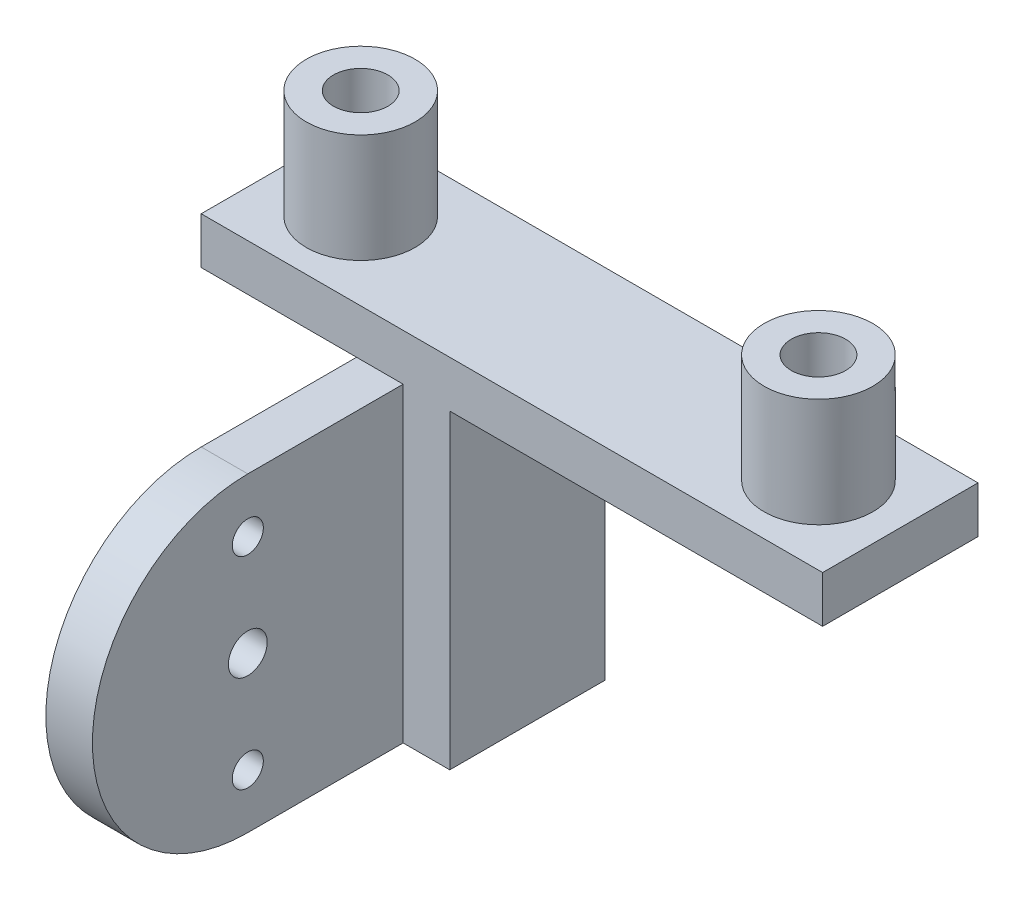
ISO-10303-21;
HEADER;
FILE_DESCRIPTION(('STEP AP214'),'2;1');
FILE_NAME('part.step','',(''),(''),'','','');
FILE_SCHEMA(('AUTOMOTIVE_DESIGN { 1 0 10303 214 1 1 1 1 }'));
ENDSEC;
DATA;
#1=APPLICATION_CONTEXT('core data for automotive mechanical design processes');
#2=APPLICATION_PROTOCOL_DEFINITION('international standard','automotive_design',2000,#1);
#3=PRODUCT_CONTEXT('',#1,'mechanical');
#4=PRODUCT('Part','Part','',(#3));
#5=PRODUCT_RELATED_PRODUCT_CATEGORY('part','',(#4));
#6=PRODUCT_DEFINITION_FORMATION('','',#4);
#7=PRODUCT_DEFINITION_CONTEXT('part definition',#1,'design');
#8=PRODUCT_DEFINITION('design','',#6,#7);
#9=PRODUCT_DEFINITION_SHAPE('','',#8);
#10=(LENGTH_UNIT() NAMED_UNIT(*) SI_UNIT(.MILLI.,.METRE.));
#11=(NAMED_UNIT(*) PLANE_ANGLE_UNIT() SI_UNIT($,.RADIAN.));
#12=(NAMED_UNIT(*) SI_UNIT($,.STERADIAN.) SOLID_ANGLE_UNIT());
#13=UNCERTAINTY_MEASURE_WITH_UNIT(LENGTH_MEASURE(1.E-05),#10,'distance_accuracy_value','');
#14=(GEOMETRIC_REPRESENTATION_CONTEXT(3) GLOBAL_UNCERTAINTY_ASSIGNED_CONTEXT((#13)) GLOBAL_UNIT_ASSIGNED_CONTEXT((#10,
#11,#12)) REPRESENTATION_CONTEXT('',''));
#15=CARTESIAN_POINT('',(0.,0.,0.));
#16=DIRECTION('',(0.,0.,1.));
#17=DIRECTION('',(1.,0.,0.));
#18=AXIS2_PLACEMENT_3D('',#15,#16,#17);
#19=CARTESIAN_POINT('',(0.,3.,0.));
#20=DIRECTION('',(0.,-1.,0.));
#21=DIRECTION('',(0.,0.,-1.));
#22=AXIS2_PLACEMENT_3D('',#19,#20,#21);
#23=PLANE('',#22);
#24=DIRECTION('',(0.,0.,1.));
#25=VECTOR('',#24,1.);
#26=CARTESIAN_POINT('',(-20.,3.,-5.));
#27=LINE('',#26,#25);
#28=CARTESIAN_POINT('',(-20.,3.,-5.));
#29=VERTEX_POINT('',#28);
#30=CARTESIAN_POINT('',(-20.,3.,5.));
#31=VERTEX_POINT('',#30);
#32=EDGE_CURVE('E190',#29,#31,#27,.T.);
#33=ORIENTED_EDGE('',*,*,#32,.T.);
#34=DIRECTION('',(1.,0.,0.));
#35=VECTOR('',#34,1.);
#36=CARTESIAN_POINT('',(20.,3.,5.));
#37=LINE('',#36,#35);
#38=CARTESIAN_POINT('',(20.,3.,5.));
#39=VERTEX_POINT('',#38);
#40=EDGE_CURVE('E193',#31,#39,#37,.T.);
#41=ORIENTED_EDGE('',*,*,#40,.T.);
#42=DIRECTION('',(0.,0.,-1.));
#43=VECTOR('',#42,1.);
#44=CARTESIAN_POINT('',(20.,3.,-5.));
#45=LINE('',#44,#43);
#46=CARTESIAN_POINT('',(20.,3.,-5.));
#47=VERTEX_POINT('',#46);
#48=EDGE_CURVE('E196',#39,#47,#45,.T.);
#49=ORIENTED_EDGE('',*,*,#48,.T.);
#50=DIRECTION('',(-1.,0.,0.));
#51=VECTOR('',#50,1.);
#52=CARTESIAN_POINT('',(20.,3.,-5.));
#53=LINE('',#52,#51);
#54=EDGE_CURVE('E198',#47,#29,#53,.T.);
#55=ORIENTED_EDGE('',*,*,#54,.T.);
#56=EDGE_LOOP('',(#33,#41,#49,#55));
#57=FACE_BOUND('',#56,.T.);
#58=CARTESIAN_POINT('',(-14.732,3.,0.));
#59=DIRECTION('',(0.,1.,0.));
#60=DIRECTION('',(0.,0.,1.));
#61=AXIS2_PLACEMENT_3D('',#58,#59,#60);
#62=CIRCLE('',#61,3.5);
#63=CARTESIAN_POINT('',(-14.732,3.,3.5));
#64=VERTEX_POINT('',#63);
#65=EDGE_CURVE('E43',#64,#64,#62,.T.);
#66=ORIENTED_EDGE('',*,*,#65,.F.);
#67=EDGE_LOOP('',(#66));
#68=FACE_BOUND('',#67,.T.);
#69=CARTESIAN_POINT('',(14.732,3.,0.));
#70=DIRECTION('',(0.,-1.,0.));
#71=DIRECTION('',(0.,0.,-1.));
#72=AXIS2_PLACEMENT_3D('',#69,#70,#71);
#73=CIRCLE('',#72,3.5);
#74=CARTESIAN_POINT('',(14.732,3.,-3.50000000000001));
#75=VERTEX_POINT('',#74);
#76=EDGE_CURVE('E11',#75,#75,#73,.F.);
#77=ORIENTED_EDGE('',*,*,#76,.F.);
#78=EDGE_LOOP('',(#77));
#79=FACE_BOUND('',#78,.T.);
#80=ADVANCED_FACE('F35',(#57,#68,#79),#23,.F.);
#81=CARTESIAN_POINT('',(0.,0.,0.));
#82=DIRECTION('',(0.,-1.,0.));
#83=DIRECTION('',(0.,0.,-1.));
#84=AXIS2_PLACEMENT_3D('',#81,#82,#83);
#85=PLANE('',#84);
#86=CARTESIAN_POINT('',(14.732,0.,0.));
#87=DIRECTION('',(0.,1.,0.));
#88=DIRECTION('',(0.,0.,1.));
#89=AXIS2_PLACEMENT_3D('',#86,#87,#88);
#90=CIRCLE('',#89,1.75);
#91=CARTESIAN_POINT('',(14.732,0.,1.74999999999999));
#92=VERTEX_POINT('',#91);
#93=EDGE_CURVE('E183',#92,#92,#90,.T.);
#94=ORIENTED_EDGE('',*,*,#93,.T.);
#95=EDGE_LOOP('',(#94));
#96=FACE_BOUND('',#95,.T.);
#97=DIRECTION('',(1.,0.,0.));
#98=VECTOR('',#97,1.);
#99=CARTESIAN_POINT('',(20.,0.,5.));
#100=LINE('',#99,#98);
#101=CARTESIAN_POINT('',(-4.,0.,5.));
#102=VERTEX_POINT('',#101);
#103=CARTESIAN_POINT('',(20.,0.,5.));
#104=VERTEX_POINT('',#103);
#105=EDGE_CURVE('E50',#102,#104,#100,.T.);
#106=ORIENTED_EDGE('',*,*,#105,.F.);
#107=DIRECTION('',(0.,0.,1.));
#108=VECTOR('',#107,1.);
#109=CARTESIAN_POINT('',(-4.,0.,4.99999999999999));
#110=LINE('',#109,#108);
#111=CARTESIAN_POINT('',(-4.,0.,-5.));
#112=VERTEX_POINT('',#111);
#113=EDGE_CURVE('E55',#112,#102,#110,.T.);
#114=ORIENTED_EDGE('',*,*,#113,.F.);
#115=DIRECTION('',(-1.,0.,0.));
#116=VECTOR('',#115,1.);
#117=CARTESIAN_POINT('',(20.,0.,-5.));
#118=LINE('',#117,#116);
#119=CARTESIAN_POINT('',(20.,0.,-5.));
#120=VERTEX_POINT('',#119);
#121=EDGE_CURVE('E194',#120,#112,#118,.T.);
#122=ORIENTED_EDGE('',*,*,#121,.F.);
#123=DIRECTION('',(0.,0.,-1.));
#124=VECTOR('',#123,1.);
#125=CARTESIAN_POINT('',(20.,0.,-5.));
#126=LINE('',#125,#124);
#127=EDGE_CURVE('E205',#104,#120,#126,.T.);
#128=ORIENTED_EDGE('',*,*,#127,.F.);
#129=EDGE_LOOP('',(#106,#114,#122,#128));
#130=FACE_BOUND('',#129,.T.);
#131=ADVANCED_FACE('F254',(#96,#130),#85,.T.);
#132=CARTESIAN_POINT('',(-7.,-10.,15.));
#133=DIRECTION('',(1.,0.,0.));
#134=DIRECTION('',(0.,0.,-1.));
#135=AXIS2_PLACEMENT_3D('',#132,#133,#134);
#136=PLANE('',#135);
#137=CARTESIAN_POINT('',(-7.,-16.5,15.));
#138=DIRECTION('',(1.,0.,0.));
#139=DIRECTION('',(0.,0.,-1.));
#140=AXIS2_PLACEMENT_3D('',#137,#138,#139);
#141=CIRCLE('',#140,1.);
#142=CARTESIAN_POINT('',(-7.,-16.5,14.));
#143=VERTEX_POINT('',#142);
#144=EDGE_CURVE('E147',#143,#143,#141,.T.);
#145=ORIENTED_EDGE('',*,*,#144,.F.);
#146=EDGE_LOOP('',(#145));
#147=FACE_BOUND('',#146,.T.);
#148=CARTESIAN_POINT('',(-7.,-3.50000000000001,15.));
#149=DIRECTION('',(1.,0.,0.));
#150=DIRECTION('',(0.,0.,-1.));
#151=AXIS2_PLACEMENT_3D('',#148,#149,#150);
#152=CIRCLE('',#151,1.);
#153=CARTESIAN_POINT('',(-7.,-3.50000000000001,14.));
#154=VERTEX_POINT('',#153);
#155=EDGE_CURVE('E153',#154,#154,#152,.T.);
#156=ORIENTED_EDGE('',*,*,#155,.F.);
#157=EDGE_LOOP('',(#156));
#158=FACE_BOUND('',#157,.T.);
#159=CARTESIAN_POINT('',(-7.,-10.,15.));
#160=DIRECTION('',(1.,0.,0.));
#161=DIRECTION('',(0.,0.,-1.));
#162=AXIS2_PLACEMENT_3D('',#159,#160,#161);
#163=CIRCLE('',#162,1.25);
#164=CARTESIAN_POINT('',(-7.,-10.,13.75));
#165=VERTEX_POINT('',#164);
#166=EDGE_CURVE('E141',#165,#165,#163,.T.);
#167=ORIENTED_EDGE('',*,*,#166,.F.);
#168=EDGE_LOOP('',(#167));
#169=FACE_BOUND('',#168,.T.);
#170=DIRECTION('',(0.,0.,-1.));
#171=VECTOR('',#170,1.);
#172=CARTESIAN_POINT('',(-7.,-20.,-5.00000000000001));
#173=LINE('',#172,#171);
#174=CARTESIAN_POINT('',(-7.,-20.,15.));
#175=VERTEX_POINT('',#174);
#176=CARTESIAN_POINT('',(-7.,-20.,4.99999999999999));
#177=VERTEX_POINT('',#176);
#178=EDGE_CURVE('E164',#175,#177,#173,.T.);
#179=ORIENTED_EDGE('',*,*,#178,.T.);
#180=DIRECTION('',(0.,1.,0.));
#181=VECTOR('',#180,1.);
#182=CARTESIAN_POINT('',(-7.,-30.4403065089105,4.99999999999999));
#183=LINE('',#182,#181);
#184=CARTESIAN_POINT('',(-7.,0.,5.));
#185=VERTEX_POINT('',#184);
#186=EDGE_CURVE('E133',#177,#185,#183,.T.);
#187=ORIENTED_EDGE('',*,*,#186,.T.);
#188=DIRECTION('',(0.,0.,1.));
#189=VECTOR('',#188,1.);
#190=CARTESIAN_POINT('',(-7.,0.,-5.));
#191=LINE('',#190,#189);
#192=CARTESIAN_POINT('',(-7.,0.,15.));
#193=VERTEX_POINT('',#192);
#194=EDGE_CURVE('E159',#185,#193,#191,.T.);
#195=ORIENTED_EDGE('',*,*,#194,.T.);
#196=CARTESIAN_POINT('',(-7.,-10.,15.));
#197=DIRECTION('',(1.,0.,0.));
#198=DIRECTION('',(0.,0.,-1.));
#199=AXIS2_PLACEMENT_3D('',#196,#197,#198);
#200=CIRCLE('',#199,9.99999999999999);
#201=EDGE_CURVE('E161',#193,#175,#200,.T.);
#202=ORIENTED_EDGE('',*,*,#201,.T.);
#203=EDGE_LOOP('',(#179,#187,#195,#202));
#204=FACE_BOUND('',#203,.T.);
#205=ADVANCED_FACE('F230',(#147,#158,#169,#204),#136,.T.);
#206=CARTESIAN_POINT('',(-14.732,0.,0.));
#207=DIRECTION('',(0.,1.,0.));
#208=DIRECTION('',(0.,0.,1.));
#209=AXIS2_PLACEMENT_3D('',#206,#207,#208);
#210=CIRCLE('',#209,1.75);
#211=CARTESIAN_POINT('',(-14.732,0.,1.75));
#212=VERTEX_POINT('',#211);
#213=EDGE_CURVE('E186',#212,#212,#210,.T.);
#214=ORIENTED_EDGE('',*,*,#213,.T.);
#215=EDGE_LOOP('',(#214));
#216=FACE_BOUND('',#215,.T.);
#217=CARTESIAN_POINT('',(-9.99999999999999,0.,-5.));
#218=VERTEX_POINT('',#217);
#219=CARTESIAN_POINT('',(-20.,0.,-5.));
#220=VERTEX_POINT('',#219);
#221=EDGE_CURVE('E207',#218,#220,#118,.T.);
#222=ORIENTED_EDGE('',*,*,#221,.F.);
#223=DIRECTION('',(0.,0.,1.));
#224=VECTOR('',#223,1.);
#225=CARTESIAN_POINT('',(-10.,0.,-5.));
#226=LINE('',#225,#224);
#227=CARTESIAN_POINT('',(-10.,0.,5.));
#228=VERTEX_POINT('',#227);
#229=EDGE_CURVE('E168',#218,#228,#226,.T.);
#230=ORIENTED_EDGE('',*,*,#229,.T.);
#231=CARTESIAN_POINT('',(-20.,0.,5.));
#232=VERTEX_POINT('',#231);
#233=EDGE_CURVE('E203',#232,#228,#100,.T.);
#234=ORIENTED_EDGE('',*,*,#233,.F.);
#235=DIRECTION('',(0.,0.,1.));
#236=VECTOR('',#235,1.);
#237=CARTESIAN_POINT('',(-20.,0.,-5.));
#238=LINE('',#237,#236);
#239=EDGE_CURVE('E189',#220,#232,#238,.T.);
#240=ORIENTED_EDGE('',*,*,#239,.F.);
#241=EDGE_LOOP('',(#222,#230,#234,#240));
#242=FACE_BOUND('',#241,.T.);
#243=ADVANCED_FACE('F239',(#216,#242),#85,.T.);
#244=CARTESIAN_POINT('',(-20.,3.,-5.));
#245=DIRECTION('',(1.,0.,0.));
#246=DIRECTION('',(0.,0.,-1.));
#247=AXIS2_PLACEMENT_3D('',#244,#245,#246);
#248=PLANE('',#247);
#249=ORIENTED_EDGE('',*,*,#239,.T.);
#250=DIRECTION('',(0.,-1.,0.));
#251=VECTOR('',#250,1.);
#252=CARTESIAN_POINT('',(-20.,3.,5.));
#253=LINE('',#252,#251);
#254=EDGE_CURVE('E216',#31,#232,#253,.T.);
#255=ORIENTED_EDGE('',*,*,#254,.F.);
#256=ORIENTED_EDGE('',*,*,#32,.F.);
#257=DIRECTION('',(0.,-1.,0.));
#258=VECTOR('',#257,1.);
#259=CARTESIAN_POINT('',(-20.,3.,-5.));
#260=LINE('',#259,#258);
#261=EDGE_CURVE('E200',#29,#220,#260,.T.);
#262=ORIENTED_EDGE('',*,*,#261,.T.);
#263=EDGE_LOOP('',(#249,#255,#256,#262));
#264=FACE_BOUND('',#263,.T.);
#265=ADVANCED_FACE('F37',(#264),#248,.F.);
#266=CARTESIAN_POINT('',(20.,3.,5.));
#267=DIRECTION('',(0.,0.,-1.));
#268=DIRECTION('',(-1.,0.,0.));
#269=AXIS2_PLACEMENT_3D('',#266,#267,#268);
#270=PLANE('',#269);
#271=ORIENTED_EDGE('',*,*,#233,.T.);
#272=DIRECTION('',(-1.,0.,0.));
#273=VECTOR('',#272,1.);
#274=CARTESIAN_POINT('',(20.,0.,5.));
#275=LINE('',#274,#273);
#276=EDGE_CURVE('E181',#185,#228,#275,.T.);
#277=ORIENTED_EDGE('',*,*,#276,.F.);
#278=ORIENTED_EDGE('',*,*,#186,.F.);
#279=DIRECTION('',(1.,0.,0.));
#280=VECTOR('',#279,1.);
#281=CARTESIAN_POINT('',(-7.,-20.,4.99999999999999));
#282=LINE('',#281,#280);
#283=CARTESIAN_POINT('',(-4.,-20.,4.99999999999999));
#284=VERTEX_POINT('',#283);
#285=EDGE_CURVE('E120',#177,#284,#282,.T.);
#286=ORIENTED_EDGE('',*,*,#285,.T.);
#287=DIRECTION('',(0.,1.,0.));
#288=VECTOR('',#287,1.);
#289=CARTESIAN_POINT('',(-4.,-30.4403065089105,4.99999999999999));
#290=LINE('',#289,#288);
#291=EDGE_CURVE('E129',#284,#102,#290,.T.);
#292=ORIENTED_EDGE('',*,*,#291,.T.);
#293=ORIENTED_EDGE('',*,*,#105,.T.);
#294=DIRECTION('',(0.,-1.,0.));
#295=VECTOR('',#294,1.);
#296=CARTESIAN_POINT('',(20.,3.,5.));
#297=LINE('',#296,#295);
#298=EDGE_CURVE('E214',#39,#104,#297,.T.);
#299=ORIENTED_EDGE('',*,*,#298,.F.);
#300=ORIENTED_EDGE('',*,*,#40,.F.);
#301=ORIENTED_EDGE('',*,*,#254,.T.);
#302=EDGE_LOOP('',(#271,#277,#278,#286,#292,#293,#299,#300,#301));
#303=FACE_BOUND('',#302,.T.);
#304=ADVANCED_FACE('F136',(#303),#270,.F.);
#305=CARTESIAN_POINT('',(20.,3.,-5.));
#306=DIRECTION('',(-1.,0.,0.));
#307=DIRECTION('',(0.,0.,1.));
#308=AXIS2_PLACEMENT_3D('',#305,#306,#307);
#309=PLANE('',#308);
#310=ORIENTED_EDGE('',*,*,#127,.T.);
#311=DIRECTION('',(0.,-1.,0.));
#312=VECTOR('',#311,1.);
#313=CARTESIAN_POINT('',(20.,3.,-5.));
#314=LINE('',#313,#312);
#315=EDGE_CURVE('E211',#47,#120,#314,.T.);
#316=ORIENTED_EDGE('',*,*,#315,.F.);
#317=ORIENTED_EDGE('',*,*,#48,.F.);
#318=ORIENTED_EDGE('',*,*,#298,.T.);
#319=EDGE_LOOP('',(#310,#316,#317,#318));
#320=FACE_BOUND('',#319,.T.);
#321=ADVANCED_FACE('F256',(#320),#309,.F.);
#322=CARTESIAN_POINT('',(20.,3.,-5.));
#323=DIRECTION('',(0.,0.,1.));
#324=DIRECTION('',(1.,0.,0.));
#325=AXIS2_PLACEMENT_3D('',#322,#323,#324);
#326=PLANE('',#325);
#327=ORIENTED_EDGE('',*,*,#121,.T.);
#328=DIRECTION('',(0.,1.,0.));
#329=VECTOR('',#328,1.);
#330=CARTESIAN_POINT('',(-4.,-30.4403065089105,-5.));
#331=LINE('',#330,#329);
#332=CARTESIAN_POINT('',(-4.,-20.,-5.));
#333=VERTEX_POINT('',#332);
#334=EDGE_CURVE('E132',#333,#112,#331,.T.);
#335=ORIENTED_EDGE('',*,*,#334,.F.);
#336=DIRECTION('',(-1.,0.,0.));
#337=VECTOR('',#336,1.);
#338=CARTESIAN_POINT('',(-7.,-20.,-5.00000000000001));
#339=LINE('',#338,#337);
#340=CARTESIAN_POINT('',(-10.,-20.,-5.00000000000001));
#341=VERTEX_POINT('',#340);
#342=EDGE_CURVE('E123',#333,#341,#339,.T.);
#343=ORIENTED_EDGE('',*,*,#342,.T.);
#344=DIRECTION('',(0.,1.,0.));
#345=VECTOR('',#344,1.);
#346=CARTESIAN_POINT('',(-10.,0.,-5.));
#347=LINE('',#346,#345);
#348=EDGE_CURVE('E156',#341,#218,#347,.T.);
#349=ORIENTED_EDGE('',*,*,#348,.T.);
#350=ORIENTED_EDGE('',*,*,#221,.T.);
#351=ORIENTED_EDGE('',*,*,#261,.F.);
#352=ORIENTED_EDGE('',*,*,#54,.F.);
#353=ORIENTED_EDGE('',*,*,#315,.T.);
#354=EDGE_LOOP('',(#327,#335,#343,#349,#350,#351,#352,#353));
#355=FACE_BOUND('',#354,.T.);
#356=ADVANCED_FACE('F251',(#355),#326,.F.);
#357=CARTESIAN_POINT('',(-14.732,3.,0.));
#358=DIRECTION('',(0.,-1.,0.));
#359=DIRECTION('',(0.,0.,-1.));
#360=AXIS2_PLACEMENT_3D('',#357,#358,#359);
#361=CYLINDRICAL_SURFACE('',#360,1.75);
#362=ORIENTED_EDGE('',*,*,#213,.F.);
#363=EDGE_LOOP('',(#362));
#364=FACE_BOUND('',#363,.T.);
#365=CARTESIAN_POINT('',(-14.732,10.,0.));
#366=DIRECTION('',(0.,1.,0.));
#367=DIRECTION('',(0.,0.,1.));
#368=AXIS2_PLACEMENT_3D('',#365,#366,#367);
#369=CIRCLE('',#368,1.75);
#370=CARTESIAN_POINT('',(-14.732,10.,1.75));
#371=VERTEX_POINT('',#370);
#372=EDGE_CURVE('E495',#371,#371,#369,.T.);
#373=ORIENTED_EDGE('',*,*,#372,.T.);
#374=EDGE_LOOP('',(#373));
#375=FACE_BOUND('',#374,.T.);
#376=ADVANCED_FACE('F278',(#364,#375),#361,.F.);
#377=CARTESIAN_POINT('',(14.732,3.,0.));
#378=DIRECTION('',(0.,-1.,0.));
#379=DIRECTION('',(0.,0.,-1.));
#380=AXIS2_PLACEMENT_3D('',#377,#378,#379);
#381=CYLINDRICAL_SURFACE('',#380,1.75);
#382=ORIENTED_EDGE('',*,*,#93,.F.);
#383=EDGE_LOOP('',(#382));
#384=FACE_BOUND('',#383,.T.);
#385=CARTESIAN_POINT('',(14.732,10.,0.));
#386=DIRECTION('',(0.,1.,0.));
#387=DIRECTION('',(0.,0.,1.));
#388=AXIS2_PLACEMENT_3D('',#385,#386,#387);
#389=CIRCLE('',#388,1.75);
#390=CARTESIAN_POINT('',(14.732,10.,1.74999999999999));
#391=VERTEX_POINT('',#390);
#392=EDGE_CURVE('E496',#391,#391,#389,.T.);
#393=ORIENTED_EDGE('',*,*,#392,.T.);
#394=EDGE_LOOP('',(#393));
#395=FACE_BOUND('',#394,.T.);
#396=ADVANCED_FACE('F300',(#384,#395),#381,.F.);
#397=CARTESIAN_POINT('',(-7.,0.,-5.));
#398=DIRECTION('',(0.,-1.,0.));
#399=DIRECTION('',(0.,0.,-1.));
#400=AXIS2_PLACEMENT_3D('',#397,#398,#399);
#401=PLANE('',#400);
#402=ORIENTED_EDGE('',*,*,#194,.F.);
#403=ORIENTED_EDGE('',*,*,#276,.T.);
#404=CARTESIAN_POINT('',(-10.,0.,15.));
#405=VERTEX_POINT('',#404);
#406=EDGE_CURVE('E167',#228,#405,#226,.T.);
#407=ORIENTED_EDGE('',*,*,#406,.T.);
#408=DIRECTION('',(-1.,0.,0.));
#409=VECTOR('',#408,1.);
#410=CARTESIAN_POINT('',(-7.,0.,15.));
#411=LINE('',#410,#409);
#412=EDGE_CURVE('E178',#193,#405,#411,.T.);
#413=ORIENTED_EDGE('',*,*,#412,.F.);
#414=EDGE_LOOP('',(#402,#403,#407,#413));
#415=FACE_BOUND('',#414,.T.);
#416=ADVANCED_FACE('F233',(#415),#401,.F.);
#417=CARTESIAN_POINT('',(-10.,-10.,15.));
#418=DIRECTION('',(1.,0.,0.));
#419=DIRECTION('',(0.,0.,-1.));
#420=AXIS2_PLACEMENT_3D('',#417,#418,#419);
#421=PLANE('',#420);
#422=ORIENTED_EDGE('',*,*,#348,.F.);
#423=DIRECTION('',(0.,0.,-1.));
#424=VECTOR('',#423,1.);
#425=CARTESIAN_POINT('',(-10.,-20.,-5.00000000000001));
#426=LINE('',#425,#424);
#427=CARTESIAN_POINT('',(-10.,-20.,15.));
#428=VERTEX_POINT('',#427);
#429=EDGE_CURVE('E162',#428,#341,#426,.T.);
#430=ORIENTED_EDGE('',*,*,#429,.F.);
#431=CARTESIAN_POINT('',(-10.,-10.,15.));
#432=DIRECTION('',(1.,0.,0.));
#433=DIRECTION('',(0.,0.,-1.));
#434=AXIS2_PLACEMENT_3D('',#431,#432,#433);
#435=CIRCLE('',#434,9.99999999999999);
#436=EDGE_CURVE('E171',#405,#428,#435,.T.);
#437=ORIENTED_EDGE('',*,*,#436,.F.);
#438=ORIENTED_EDGE('',*,*,#406,.F.);
#439=ORIENTED_EDGE('',*,*,#229,.F.);
#440=EDGE_LOOP('',(#422,#430,#437,#438,#439));
#441=FACE_BOUND('',#440,.T.);
#442=CARTESIAN_POINT('',(-10.,-3.50000000000001,15.));
#443=DIRECTION('',(1.,0.,0.));
#444=DIRECTION('',(0.,0.,-1.));
#445=AXIS2_PLACEMENT_3D('',#442,#443,#444);
#446=CIRCLE('',#445,1.);
#447=CARTESIAN_POINT('',(-10.,-3.50000000000001,14.));
#448=VERTEX_POINT('',#447);
#449=EDGE_CURVE('E150',#448,#448,#446,.T.);
#450=ORIENTED_EDGE('',*,*,#449,.T.);
#451=EDGE_LOOP('',(#450));
#452=FACE_BOUND('',#451,.T.);
#453=CARTESIAN_POINT('',(-10.,-16.5,15.));
#454=DIRECTION('',(1.,0.,0.));
#455=DIRECTION('',(0.,0.,-1.));
#456=AXIS2_PLACEMENT_3D('',#453,#454,#455);
#457=CIRCLE('',#456,1.);
#458=CARTESIAN_POINT('',(-10.,-16.5,14.));
#459=VERTEX_POINT('',#458);
#460=EDGE_CURVE('E144',#459,#459,#457,.T.);
#461=ORIENTED_EDGE('',*,*,#460,.T.);
#462=EDGE_LOOP('',(#461));
#463=FACE_BOUND('',#462,.T.);
#464=CARTESIAN_POINT('',(-10.,-10.,15.));
#465=DIRECTION('',(1.,0.,0.));
#466=DIRECTION('',(0.,0.,-1.));
#467=AXIS2_PLACEMENT_3D('',#464,#465,#466);
#468=CIRCLE('',#467,1.25);
#469=CARTESIAN_POINT('',(-10.,-10.,13.75));
#470=VERTEX_POINT('',#469);
#471=EDGE_CURVE('E127',#470,#470,#468,.T.);
#472=ORIENTED_EDGE('',*,*,#471,.T.);
#473=EDGE_LOOP('',(#472));
#474=FACE_BOUND('',#473,.T.);
#475=ADVANCED_FACE('F243',(#441,#452,#463,#474),#421,.F.);
#476=CARTESIAN_POINT('',(-7.,-10.,15.));
#477=DIRECTION('',(-1.,0.,0.));
#478=DIRECTION('',(0.,0.,1.));
#479=AXIS2_PLACEMENT_3D('',#476,#477,#478);
#480=CYLINDRICAL_SURFACE('',#479,9.99999999999999);
#481=ORIENTED_EDGE('',*,*,#436,.T.);
#482=DIRECTION('',(-1.,0.,0.));
#483=VECTOR('',#482,1.);
#484=CARTESIAN_POINT('',(-7.,-20.,15.));
#485=LINE('',#484,#483);
#486=EDGE_CURVE('E175',#175,#428,#485,.T.);
#487=ORIENTED_EDGE('',*,*,#486,.F.);
#488=ORIENTED_EDGE('',*,*,#201,.F.);
#489=ORIENTED_EDGE('',*,*,#412,.T.);
#490=EDGE_LOOP('',(#481,#487,#488,#489));
#491=FACE_BOUND('',#490,.T.);
#492=ADVANCED_FACE('F248',(#491),#480,.T.);
#493=CARTESIAN_POINT('',(-7.,-20.,-5.00000000000001));
#494=DIRECTION('',(0.,1.,0.));
#495=DIRECTION('',(0.,0.,1.));
#496=AXIS2_PLACEMENT_3D('',#493,#494,#495);
#497=PLANE('',#496);
#498=ORIENTED_EDGE('',*,*,#429,.T.);
#499=ORIENTED_EDGE('',*,*,#342,.F.);
#500=DIRECTION('',(0.,0.,-1.));
#501=VECTOR('',#500,1.);
#502=CARTESIAN_POINT('',(-4.,-20.,4.99999999999999));
#503=LINE('',#502,#501);
#504=EDGE_CURVE('E115',#284,#333,#503,.T.);
#505=ORIENTED_EDGE('',*,*,#504,.F.);
#506=ORIENTED_EDGE('',*,*,#285,.F.);
#507=ORIENTED_EDGE('',*,*,#178,.F.);
#508=ORIENTED_EDGE('',*,*,#486,.T.);
#509=EDGE_LOOP('',(#498,#499,#505,#506,#507,#508));
#510=FACE_BOUND('',#509,.T.);
#511=ADVANCED_FACE('F117',(#510),#497,.F.);
#512=CARTESIAN_POINT('',(-7.,-3.50000000000001,15.));
#513=DIRECTION('',(-1.,0.,0.));
#514=DIRECTION('',(0.,0.,1.));
#515=AXIS2_PLACEMENT_3D('',#512,#513,#514);
#516=CYLINDRICAL_SURFACE('',#515,1.);
#517=ORIENTED_EDGE('',*,*,#155,.T.);
#518=EDGE_LOOP('',(#517));
#519=FACE_BOUND('',#518,.T.);
#520=ORIENTED_EDGE('',*,*,#449,.F.);
#521=EDGE_LOOP('',(#520));
#522=FACE_BOUND('',#521,.T.);
#523=ADVANCED_FACE('F332',(#519,#522),#516,.F.);
#524=CARTESIAN_POINT('',(-7.,-16.5,15.));
#525=DIRECTION('',(-1.,0.,0.));
#526=DIRECTION('',(0.,0.,1.));
#527=AXIS2_PLACEMENT_3D('',#524,#525,#526);
#528=CYLINDRICAL_SURFACE('',#527,1.);
#529=ORIENTED_EDGE('',*,*,#144,.T.);
#530=EDGE_LOOP('',(#529));
#531=FACE_BOUND('',#530,.T.);
#532=ORIENTED_EDGE('',*,*,#460,.F.);
#533=EDGE_LOOP('',(#532));
#534=FACE_BOUND('',#533,.T.);
#535=ADVANCED_FACE('F339',(#531,#534),#528,.F.);
#536=CARTESIAN_POINT('',(-7.,-10.,15.));
#537=DIRECTION('',(-1.,0.,0.));
#538=DIRECTION('',(0.,0.,1.));
#539=AXIS2_PLACEMENT_3D('',#536,#537,#538);
#540=CYLINDRICAL_SURFACE('',#539,1.25);
#541=ORIENTED_EDGE('',*,*,#166,.T.);
#542=EDGE_LOOP('',(#541));
#543=FACE_BOUND('',#542,.T.);
#544=ORIENTED_EDGE('',*,*,#471,.F.);
#545=EDGE_LOOP('',(#544));
#546=FACE_BOUND('',#545,.T.);
#547=ADVANCED_FACE('F347',(#543,#546),#540,.F.);
#548=CARTESIAN_POINT('',(-4.,-30.4403065089105,4.99999999999999));
#549=DIRECTION('',(-1.,0.,0.));
#550=DIRECTION('',(0.,0.,1.));
#551=AXIS2_PLACEMENT_3D('',#548,#549,#550);
#552=PLANE('',#551);
#553=ORIENTED_EDGE('',*,*,#291,.F.);
#554=ORIENTED_EDGE('',*,*,#504,.T.);
#555=ORIENTED_EDGE('',*,*,#334,.T.);
#556=ORIENTED_EDGE('',*,*,#113,.T.);
#557=EDGE_LOOP('',(#553,#554,#555,#556));
#558=FACE_BOUND('',#557,.T.);
#559=ADVANCED_FACE('F130',(#558),#552,.F.);
#560=CARTESIAN_POINT('',(-14.732,10.,0.));
#561=DIRECTION('',(0.,1.,0.));
#562=DIRECTION('',(0.,0.,1.));
#563=AXIS2_PLACEMENT_3D('',#560,#561,#562);
#564=PLANE('',#563);
#565=CARTESIAN_POINT('',(-14.732,10.,0.));
#566=DIRECTION('',(0.,1.,0.));
#567=DIRECTION('',(0.,0.,1.));
#568=AXIS2_PLACEMENT_3D('',#565,#566,#567);
#569=CIRCLE('',#568,3.5);
#570=CARTESIAN_POINT('',(-14.732,10.,3.5));
#571=VERTEX_POINT('',#570);
#572=EDGE_CURVE('E224',#571,#571,#569,.T.);
#573=ORIENTED_EDGE('',*,*,#572,.T.);
#574=EDGE_LOOP('',(#573));
#575=FACE_BOUND('',#574,.T.);
#576=ORIENTED_EDGE('',*,*,#372,.F.);
#577=EDGE_LOOP('',(#576));
#578=FACE_BOUND('',#577,.T.);
#579=ADVANCED_FACE('F362',(#575,#578),#564,.T.);
#580=CARTESIAN_POINT('',(-14.732,10.,0.));
#581=DIRECTION('',(0.,-1.,0.));
#582=DIRECTION('',(0.,0.,-1.));
#583=AXIS2_PLACEMENT_3D('',#580,#581,#582);
#584=CYLINDRICAL_SURFACE('',#583,3.5);
#585=ORIENTED_EDGE('',*,*,#572,.F.);
#586=EDGE_LOOP('',(#585));
#587=FACE_BOUND('',#586,.T.);
#588=ORIENTED_EDGE('',*,*,#65,.T.);
#589=EDGE_LOOP('',(#588));
#590=FACE_BOUND('',#589,.T.);
#591=ADVANCED_FACE('F368',(#587,#590),#584,.T.);
#592=CARTESIAN_POINT('',(14.732,10.,0.));
#593=DIRECTION('',(0.,1.,0.));
#594=DIRECTION('',(0.,0.,1.));
#595=AXIS2_PLACEMENT_3D('',#592,#593,#594);
#596=PLANE('',#595);
#597=CARTESIAN_POINT('',(14.732,10.,0.));
#598=DIRECTION('',(0.,1.,0.));
#599=DIRECTION('',(0.,0.,1.));
#600=AXIS2_PLACEMENT_3D('',#597,#598,#599);
#601=CIRCLE('',#600,3.5);
#602=CARTESIAN_POINT('',(14.732,10.,3.49999999999999));
#603=VERTEX_POINT('',#602);
#604=EDGE_CURVE('E492',#603,#603,#601,.T.);
#605=ORIENTED_EDGE('',*,*,#604,.T.);
#606=EDGE_LOOP('',(#605));
#607=FACE_BOUND('',#606,.T.);
#608=ORIENTED_EDGE('',*,*,#392,.F.);
#609=EDGE_LOOP('',(#608));
#610=FACE_BOUND('',#609,.T.);
#611=ADVANCED_FACE('F376',(#607,#610),#596,.T.);
#612=CARTESIAN_POINT('',(14.732,10.,0.));
#613=DIRECTION('',(0.,-1.,0.));
#614=DIRECTION('',(0.,0.,-1.));
#615=AXIS2_PLACEMENT_3D('',#612,#613,#614);
#616=CYLINDRICAL_SURFACE('',#615,3.5);
#617=ORIENTED_EDGE('',*,*,#604,.F.);
#618=EDGE_LOOP('',(#617));
#619=FACE_BOUND('',#618,.T.);
#620=ORIENTED_EDGE('',*,*,#76,.T.);
#621=EDGE_LOOP('',(#620));
#622=FACE_BOUND('',#621,.T.);
#623=ADVANCED_FACE('F384',(#619,#622),#616,.T.);
#624=CLOSED_SHELL('',(#80,#131,#205,#243,#265,#304,#321,#356,#376,#396,#416,#475,#492,#511,#523,
#535,#547,#559,#579,#591,#611,#623));
#625=MANIFOLD_SOLID_BREP('B2',#624);
#626=ADVANCED_BREP_SHAPE_REPRESENTATION('',(#18,#625),#14);
#627=SHAPE_DEFINITION_REPRESENTATION(#9,#626);
ENDSEC;
END-ISO-10303-21;
